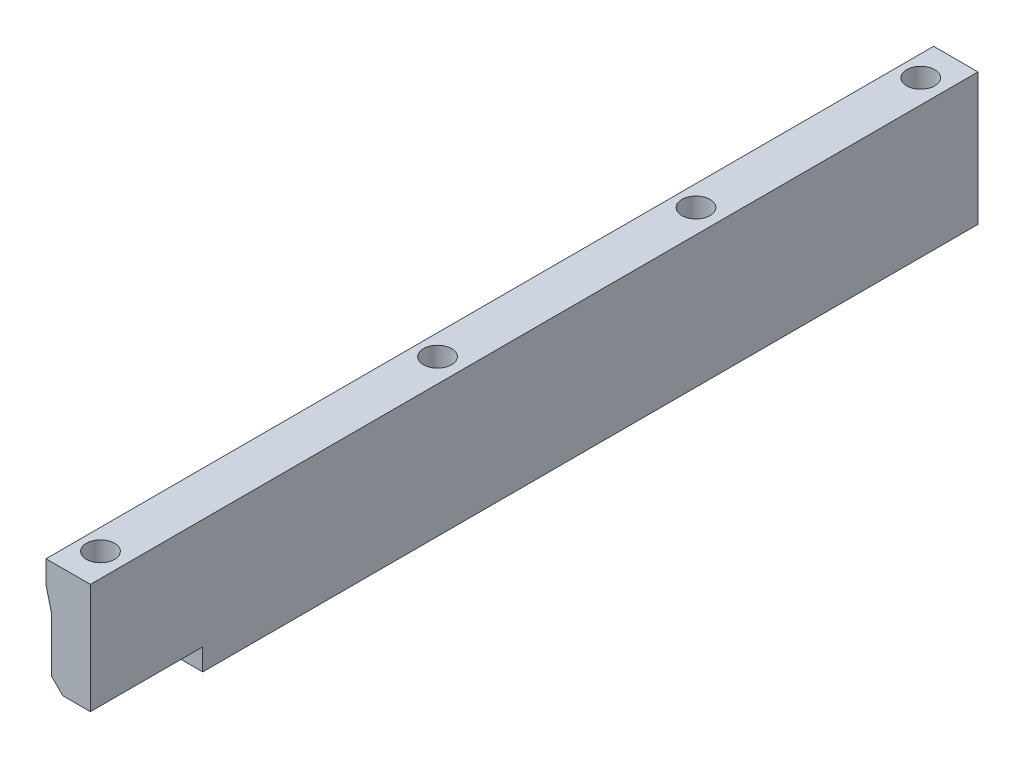
ISO-10303-21;
HEADER;
FILE_DESCRIPTION(('STEP AP214'),'2;1');
FILE_NAME('part.step','',(''),(''),'','','');
FILE_SCHEMA(('AUTOMOTIVE_DESIGN { 1 0 10303 214 1 1 1 1 }'));
ENDSEC;
DATA;
#1=APPLICATION_CONTEXT('core data for automotive mechanical design processes');
#2=APPLICATION_PROTOCOL_DEFINITION('international standard','automotive_design',2000,#1);
#3=PRODUCT_CONTEXT('',#1,'mechanical');
#4=PRODUCT('Part','Part','',(#3));
#5=PRODUCT_RELATED_PRODUCT_CATEGORY('part','',(#4));
#6=PRODUCT_DEFINITION_FORMATION('','',#4);
#7=PRODUCT_DEFINITION_CONTEXT('part definition',#1,'design');
#8=PRODUCT_DEFINITION('design','',#6,#7);
#9=PRODUCT_DEFINITION_SHAPE('','',#8);
#10=(LENGTH_UNIT() NAMED_UNIT(*) SI_UNIT(.MILLI.,.METRE.));
#11=(NAMED_UNIT(*) PLANE_ANGLE_UNIT() SI_UNIT($,.RADIAN.));
#12=(NAMED_UNIT(*) SI_UNIT($,.STERADIAN.) SOLID_ANGLE_UNIT());
#13=UNCERTAINTY_MEASURE_WITH_UNIT(LENGTH_MEASURE(1.E-05),#10,'distance_accuracy_value','');
#14=(GEOMETRIC_REPRESENTATION_CONTEXT(3) GLOBAL_UNCERTAINTY_ASSIGNED_CONTEXT((#13)) GLOBAL_UNIT_ASSIGNED_CONTEXT((#10,
#11,#12)) REPRESENTATION_CONTEXT('',''));
#15=CARTESIAN_POINT('',(0.,0.,0.));
#16=DIRECTION('',(0.,0.,1.));
#17=DIRECTION('',(1.,0.,0.));
#18=AXIS2_PLACEMENT_3D('',#15,#16,#17);
#19=CARTESIAN_POINT('',(0.,0.,0.));
#20=DIRECTION('',(0.,0.,-1.));
#21=DIRECTION('',(-1.,0.,0.));
#22=AXIS2_PLACEMENT_3D('',#19,#20,#21);
#23=PLANE('',#22);
#24=DIRECTION('',(0.,-1.,0.));
#25=VECTOR('',#24,1.);
#26=CARTESIAN_POINT('',(-45.4,0.,0.));
#27=LINE('',#26,#25);
#28=CARTESIAN_POINT('',(-45.4,2.25,0.));
#29=VERTEX_POINT('',#28);
#30=CARTESIAN_POINT('',(-45.4,-2.25,0.));
#31=VERTEX_POINT('',#30);
#32=EDGE_CURVE('E175',#29,#31,#27,.T.);
#33=ORIENTED_EDGE('',*,*,#32,.F.);
#34=DIRECTION('',(-1.,0.,0.));
#35=VECTOR('',#34,1.);
#36=CARTESIAN_POINT('',(-48.6,2.25,0.));
#37=LINE('',#36,#35);
#38=CARTESIAN_POINT('',(-48.6,2.25,0.));
#39=VERTEX_POINT('',#38);
#40=EDGE_CURVE('E210',#29,#39,#37,.T.);
#41=ORIENTED_EDGE('',*,*,#40,.T.);
#42=DIRECTION('',(0.,-1.,0.));
#43=VECTOR('',#42,1.);
#44=CARTESIAN_POINT('',(-48.6,-2.25,0.));
#45=LINE('',#44,#43);
#46=CARTESIAN_POINT('',(-48.6,-2.25,0.));
#47=VERTEX_POINT('',#46);
#48=EDGE_CURVE('E213',#39,#47,#45,.T.);
#49=ORIENTED_EDGE('',*,*,#48,.T.);
#50=DIRECTION('',(1.,0.,0.));
#51=VECTOR('',#50,1.);
#52=CARTESIAN_POINT('',(-45.4,-2.25,0.));
#53=LINE('',#52,#51);
#54=EDGE_CURVE('E216',#47,#31,#53,.T.);
#55=ORIENTED_EDGE('',*,*,#54,.T.);
#56=EDGE_LOOP('',(#33,#41,#49,#55));
#57=FACE_BOUND('',#56,.T.);
#58=ADVANCED_FACE('F34',(#57),#23,.F.);
#59=CARTESIAN_POINT('',(-38.5,14.25,-138.));
#60=DIRECTION('',(1.,0.,0.));
#61=DIRECTION('',(0.,0.,-1.));
#62=AXIS2_PLACEMENT_3D('',#59,#60,#61);
#63=PLANE('',#62);
#64=DIRECTION('',(0.,1.,0.));
#65=VECTOR('',#64,1.);
#66=CARTESIAN_POINT('',(-38.5,14.25,0.));
#67=LINE('',#66,#65);
#68=CARTESIAN_POINT('',(-38.5,-9.25,0.));
#69=VERTEX_POINT('',#68);
#70=CARTESIAN_POINT('',(-38.5,-5.37654590485204,0.));
#71=VERTEX_POINT('',#70);
#72=EDGE_CURVE('E147',#69,#71,#67,.T.);
#73=ORIENTED_EDGE('',*,*,#72,.F.);
#74=DIRECTION('',(0.,0.,1.));
#75=VECTOR('',#74,1.);
#76=CARTESIAN_POINT('',(-38.5,-9.25,-138.));
#77=LINE('',#76,#75);
#78=CARTESIAN_POINT('',(-38.5,-9.25,-138.));
#79=VERTEX_POINT('',#78);
#80=EDGE_CURVE('E178',#79,#69,#77,.T.);
#81=ORIENTED_EDGE('',*,*,#80,.F.);
#82=DIRECTION('',(0.,1.,0.));
#83=VECTOR('',#82,1.);
#84=CARTESIAN_POINT('',(-38.5,14.25,-138.));
#85=LINE('',#84,#83);
#86=CARTESIAN_POINT('',(-38.5,14.25,-138.));
#87=VERTEX_POINT('',#86);
#88=EDGE_CURVE('E181',#79,#87,#85,.T.);
#89=ORIENTED_EDGE('',*,*,#88,.T.);
#90=DIRECTION('',(0.,0.,1.));
#91=VECTOR('',#90,1.);
#92=CARTESIAN_POINT('',(-38.5,14.25,-138.));
#93=LINE('',#92,#91);
#94=CARTESIAN_POINT('',(-38.5,14.25,20.));
#95=VERTEX_POINT('',#94);
#96=EDGE_CURVE('E154',#87,#95,#93,.T.);
#97=ORIENTED_EDGE('',*,*,#96,.T.);
#98=DIRECTION('',(0.,1.,0.));
#99=VECTOR('',#98,1.);
#100=CARTESIAN_POINT('',(-38.5,0.,20.));
#101=LINE('',#100,#99);
#102=CARTESIAN_POINT('',(-38.5,-5.37654590485204,20.));
#103=VERTEX_POINT('',#102);
#104=EDGE_CURVE('E151',#103,#95,#101,.T.);
#105=ORIENTED_EDGE('',*,*,#104,.F.);
#106=DIRECTION('',(0.,0.,-1.));
#107=VECTOR('',#106,1.);
#108=CARTESIAN_POINT('',(-38.5,-5.37654590485204,20.));
#109=LINE('',#108,#107);
#110=EDGE_CURVE('E135',#103,#71,#109,.T.);
#111=ORIENTED_EDGE('',*,*,#110,.T.);
#112=EDGE_LOOP('',(#73,#81,#89,#97,#105,#111));
#113=FACE_BOUND('',#112,.T.);
#114=ADVANCED_FACE('F152',(#113),#63,.T.);
#115=CARTESIAN_POINT('',(-38.5,-9.25,-138.));
#116=DIRECTION('',(0.,-1.,0.));
#117=DIRECTION('',(0.,0.,-1.));
#118=AXIS2_PLACEMENT_3D('',#115,#116,#117);
#119=PLANE('',#118);
#120=DIRECTION('',(1.,0.,0.));
#121=VECTOR('',#120,1.);
#122=CARTESIAN_POINT('',(-38.5,-9.25,0.));
#123=LINE('',#122,#121);
#124=CARTESIAN_POINT('',(-43.4,-9.25,0.));
#125=VERTEX_POINT('',#124);
#126=EDGE_CURVE('E184',#125,#69,#123,.T.);
#127=ORIENTED_EDGE('',*,*,#126,.F.);
#128=DIRECTION('',(0.,0.,-1.));
#129=VECTOR('',#128,1.);
#130=CARTESIAN_POINT('',(-43.4,-9.25,-138.));
#131=LINE('',#130,#129);
#132=CARTESIAN_POINT('',(-43.4,-9.25,-138.));
#133=VERTEX_POINT('',#132);
#134=EDGE_CURVE('E49',#125,#133,#131,.T.);
#135=ORIENTED_EDGE('',*,*,#134,.T.);
#136=DIRECTION('',(1.,0.,0.));
#137=VECTOR('',#136,1.);
#138=CARTESIAN_POINT('',(-38.5,-9.25,-138.));
#139=LINE('',#138,#137);
#140=EDGE_CURVE('E207',#133,#79,#139,.T.);
#141=ORIENTED_EDGE('',*,*,#140,.T.);
#142=ORIENTED_EDGE('',*,*,#80,.T.);
#143=EDGE_LOOP('',(#127,#135,#141,#142));
#144=FACE_BOUND('',#143,.T.);
#145=ADVANCED_FACE('F273',(#144),#119,.T.);
#146=CARTESIAN_POINT('',(-45.4,-9.25,-138.));
#147=DIRECTION('',(-1.,0.,0.));
#148=DIRECTION('',(0.,-1.,0.));
#149=AXIS2_PLACEMENT_3D('',#146,#147,#148);
#150=PLANE('',#149);
#151=DIRECTION('',(0.,-1.,0.));
#152=VECTOR('',#151,1.);
#153=CARTESIAN_POINT('',(-45.4,-9.25,0.));
#154=LINE('',#153,#152);
#155=CARTESIAN_POINT('',(-45.4,-3.37654590485205,0.));
#156=VERTEX_POINT('',#155);
#157=CARTESIAN_POINT('',(-45.4,-7.25000000000001,0.));
#158=VERTEX_POINT('',#157);
#159=EDGE_CURVE('E219',#156,#158,#154,.T.);
#160=ORIENTED_EDGE('',*,*,#159,.F.);
#161=DIRECTION('',(0.,0.,1.));
#162=VECTOR('',#161,1.);
#163=CARTESIAN_POINT('',(-45.4,-3.37654590485205,-138.));
#164=LINE('',#163,#162);
#165=CARTESIAN_POINT('',(-45.4,-3.37654590485205,20.));
#166=VERTEX_POINT('',#165);
#167=EDGE_CURVE('E245',#156,#166,#164,.T.);
#168=ORIENTED_EDGE('',*,*,#167,.T.);
#169=DIRECTION('',(0.,-1.,0.));
#170=VECTOR('',#169,1.);
#171=CARTESIAN_POINT('',(-45.4,0.,20.));
#172=LINE('',#171,#170);
#173=CARTESIAN_POINT('',(-45.4,6.25,20.));
#174=VERTEX_POINT('',#173);
#175=EDGE_CURVE('E164',#174,#166,#172,.T.);
#176=ORIENTED_EDGE('',*,*,#175,.F.);
#177=DIRECTION('',(0.,0.,1.));
#178=VECTOR('',#177,1.);
#179=CARTESIAN_POINT('',(-45.4,6.25,-138.));
#180=LINE('',#179,#178);
#181=CARTESIAN_POINT('',(-45.4,6.25,-138.));
#182=VERTEX_POINT('',#181);
#183=EDGE_CURVE('E234',#182,#174,#180,.T.);
#184=ORIENTED_EDGE('',*,*,#183,.F.);
#185=DIRECTION('',(0.,-1.,0.));
#186=VECTOR('',#185,1.);
#187=CARTESIAN_POINT('',(-45.4,2.25,-138.));
#188=LINE('',#187,#186);
#189=CARTESIAN_POINT('',(-45.4,2.25,-138.));
#190=VERTEX_POINT('',#189);
#191=EDGE_CURVE('E192',#182,#190,#188,.T.);
#192=ORIENTED_EDGE('',*,*,#191,.T.);
#193=DIRECTION('',(0.,0.,1.));
#194=VECTOR('',#193,1.);
#195=CARTESIAN_POINT('',(-45.4,2.25,-138.));
#196=LINE('',#195,#194);
#197=EDGE_CURVE('E231',#190,#29,#196,.T.);
#198=ORIENTED_EDGE('',*,*,#197,.T.);
#199=ORIENTED_EDGE('',*,*,#32,.T.);
#200=DIRECTION('',(0.,0.,1.));
#201=VECTOR('',#200,1.);
#202=CARTESIAN_POINT('',(-45.4,-2.25,-138.));
#203=LINE('',#202,#201);
#204=CARTESIAN_POINT('',(-45.4,-2.25,-138.));
#205=VERTEX_POINT('',#204);
#206=EDGE_CURVE('E224',#205,#31,#203,.T.);
#207=ORIENTED_EDGE('',*,*,#206,.F.);
#208=DIRECTION('',(0.,-1.,0.));
#209=VECTOR('',#208,1.);
#210=CARTESIAN_POINT('',(-45.4,-9.25,-138.));
#211=LINE('',#210,#209);
#212=CARTESIAN_POINT('',(-45.4,-7.25000000000001,-138.));
#213=VERTEX_POINT('',#212);
#214=EDGE_CURVE('E204',#205,#213,#211,.T.);
#215=ORIENTED_EDGE('',*,*,#214,.T.);
#216=DIRECTION('',(0.,0.,1.));
#217=VECTOR('',#216,1.);
#218=CARTESIAN_POINT('',(-45.4,-7.25000000000001,-138.));
#219=LINE('',#218,#217);
#220=EDGE_CURVE('E242',#213,#158,#219,.T.);
#221=ORIENTED_EDGE('',*,*,#220,.T.);
#222=EDGE_LOOP('',(#160,#168,#176,#184,#192,#198,#199,#207,#215,#221));
#223=FACE_BOUND('',#222,.T.);
#224=ADVANCED_FACE('F258',(#223),#150,.T.);
#225=CARTESIAN_POINT('',(-45.4,-2.25,-138.));
#226=DIRECTION('',(0.,-1.,0.));
#227=DIRECTION('',(0.,0.,-1.));
#228=AXIS2_PLACEMENT_3D('',#225,#226,#227);
#229=PLANE('',#228);
#230=ORIENTED_EDGE('',*,*,#54,.F.);
#231=DIRECTION('',(0.,0.,1.));
#232=VECTOR('',#231,1.);
#233=CARTESIAN_POINT('',(-48.6,-2.25,-138.));
#234=LINE('',#233,#232);
#235=CARTESIAN_POINT('',(-48.6,-2.25,-138.));
#236=VERTEX_POINT('',#235);
#237=EDGE_CURVE('E227',#236,#47,#234,.T.);
#238=ORIENTED_EDGE('',*,*,#237,.F.);
#239=DIRECTION('',(1.,0.,0.));
#240=VECTOR('',#239,1.);
#241=CARTESIAN_POINT('',(-45.4,-2.25,-138.));
#242=LINE('',#241,#240);
#243=EDGE_CURVE('E201',#236,#205,#242,.T.);
#244=ORIENTED_EDGE('',*,*,#243,.T.);
#245=ORIENTED_EDGE('',*,*,#206,.T.);
#246=EDGE_LOOP('',(#230,#238,#244,#245));
#247=FACE_BOUND('',#246,.T.);
#248=ADVANCED_FACE('F307',(#247),#229,.T.);
#249=CARTESIAN_POINT('',(-48.6,-2.25,-138.));
#250=DIRECTION('',(-1.,0.,0.));
#251=DIRECTION('',(0.,0.,1.));
#252=AXIS2_PLACEMENT_3D('',#249,#250,#251);
#253=PLANE('',#252);
#254=ORIENTED_EDGE('',*,*,#48,.F.);
#255=DIRECTION('',(0.,0.,1.));
#256=VECTOR('',#255,1.);
#257=CARTESIAN_POINT('',(-48.6,2.25,-138.));
#258=LINE('',#257,#256);
#259=CARTESIAN_POINT('',(-48.6,2.25,-138.));
#260=VERTEX_POINT('',#259);
#261=EDGE_CURVE('E229',#260,#39,#258,.T.);
#262=ORIENTED_EDGE('',*,*,#261,.F.);
#263=DIRECTION('',(0.,-1.,0.));
#264=VECTOR('',#263,1.);
#265=CARTESIAN_POINT('',(-48.6,-2.25,-138.));
#266=LINE('',#265,#264);
#267=EDGE_CURVE('E198',#260,#236,#266,.T.);
#268=ORIENTED_EDGE('',*,*,#267,.T.);
#269=ORIENTED_EDGE('',*,*,#237,.T.);
#270=EDGE_LOOP('',(#254,#262,#268,#269));
#271=FACE_BOUND('',#270,.T.);
#272=ADVANCED_FACE('F309',(#271),#253,.T.);
#273=CARTESIAN_POINT('',(-48.6,2.25,-138.));
#274=DIRECTION('',(0.,1.,0.));
#275=DIRECTION('',(0.,0.,1.));
#276=AXIS2_PLACEMENT_3D('',#273,#274,#275);
#277=PLANE('',#276);
#278=ORIENTED_EDGE('',*,*,#40,.F.);
#279=ORIENTED_EDGE('',*,*,#197,.F.);
#280=DIRECTION('',(-1.,0.,0.));
#281=VECTOR('',#280,1.);
#282=CARTESIAN_POINT('',(-48.6,2.25,-138.));
#283=LINE('',#282,#281);
#284=EDGE_CURVE('E195',#190,#260,#283,.T.);
#285=ORIENTED_EDGE('',*,*,#284,.T.);
#286=ORIENTED_EDGE('',*,*,#261,.T.);
#287=EDGE_LOOP('',(#278,#279,#285,#286));
#288=FACE_BOUND('',#287,.T.);
#289=ADVANCED_FACE('F303',(#288),#277,.T.);
#290=CARTESIAN_POINT('',(-46.4,10.25,-138.));
#291=DIRECTION('',(-0.970142500145332,-0.242535625036333,0.));
#292=DIRECTION('',(0.242535625036333,-0.970142500145332,0.));
#293=AXIS2_PLACEMENT_3D('',#290,#291,#292);
#294=PLANE('',#293);
#295=ORIENTED_EDGE('',*,*,#183,.T.);
#296=DIRECTION('',(0.242535625036333,-0.970142500145332,0.));
#297=VECTOR('',#296,1.);
#298=CARTESIAN_POINT('',(-41.2588235294118,-10.3147058823529,20.));
#299=LINE('',#298,#297);
#300=CARTESIAN_POINT('',(-46.4,10.25,20.));
#301=VERTEX_POINT('',#300);
#302=EDGE_CURVE('E148',#301,#174,#299,.T.);
#303=ORIENTED_EDGE('',*,*,#302,.F.);
#304=DIRECTION('',(0.,0.,1.));
#305=VECTOR('',#304,1.);
#306=CARTESIAN_POINT('',(-46.4,10.25,-138.));
#307=LINE('',#306,#305);
#308=CARTESIAN_POINT('',(-46.4,10.25,-138.));
#309=VERTEX_POINT('',#308);
#310=EDGE_CURVE('E236',#309,#301,#307,.T.);
#311=ORIENTED_EDGE('',*,*,#310,.F.);
#312=DIRECTION('',(0.242535625036333,-0.970142500145332,0.));
#313=VECTOR('',#312,1.);
#314=CARTESIAN_POINT('',(-46.4,10.25,-138.));
#315=LINE('',#314,#313);
#316=EDGE_CURVE('E189',#309,#182,#315,.T.);
#317=ORIENTED_EDGE('',*,*,#316,.T.);
#318=EDGE_LOOP('',(#295,#303,#311,#317));
#319=FACE_BOUND('',#318,.T.);
#320=ADVANCED_FACE('F297',(#319),#294,.T.);
#321=CARTESIAN_POINT('',(-46.4,14.25,-138.));
#322=DIRECTION('',(-1.,0.,0.));
#323=DIRECTION('',(0.,0.,1.));
#324=AXIS2_PLACEMENT_3D('',#321,#322,#323);
#325=PLANE('',#324);
#326=ORIENTED_EDGE('',*,*,#310,.T.);
#327=DIRECTION('',(0.,-1.,0.));
#328=VECTOR('',#327,1.);
#329=CARTESIAN_POINT('',(-46.4,0.,20.));
#330=LINE('',#329,#328);
#331=CARTESIAN_POINT('',(-46.4,14.25,20.));
#332=VERTEX_POINT('',#331);
#333=EDGE_CURVE('E170',#332,#301,#330,.T.);
#334=ORIENTED_EDGE('',*,*,#333,.F.);
#335=DIRECTION('',(0.,0.,1.));
#336=VECTOR('',#335,1.);
#337=CARTESIAN_POINT('',(-46.4,14.25,-138.));
#338=LINE('',#337,#336);
#339=CARTESIAN_POINT('',(-46.4,14.25,-138.));
#340=VERTEX_POINT('',#339);
#341=EDGE_CURVE('E238',#340,#332,#338,.T.);
#342=ORIENTED_EDGE('',*,*,#341,.F.);
#343=DIRECTION('',(0.,-1.,0.));
#344=VECTOR('',#343,1.);
#345=CARTESIAN_POINT('',(-46.4,14.25,-138.));
#346=LINE('',#345,#344);
#347=EDGE_CURVE('E186',#340,#309,#346,.T.);
#348=ORIENTED_EDGE('',*,*,#347,.T.);
#349=EDGE_LOOP('',(#326,#334,#342,#348));
#350=FACE_BOUND('',#349,.T.);
#351=ADVANCED_FACE('F295',(#350),#325,.T.);
#352=CARTESIAN_POINT('',(-45.4,14.25,-138.));
#353=DIRECTION('',(0.,1.,0.));
#354=DIRECTION('',(0.,0.,1.));
#355=AXIS2_PLACEMENT_3D('',#352,#353,#354);
#356=PLANE('',#355);
#357=CARTESIAN_POINT('',(-42.7,14.25,-132.));
#358=DIRECTION('',(0.,1.,0.));
#359=DIRECTION('',(0.,0.,1.));
#360=AXIS2_PLACEMENT_3D('',#357,#358,#359);
#361=CIRCLE('',#360,2.5);
#362=CARTESIAN_POINT('',(-42.7,14.25,-129.5));
#363=VERTEX_POINT('',#362);
#364=EDGE_CURVE('E331',#363,#363,#361,.T.);
#365=ORIENTED_EDGE('',*,*,#364,.F.);
#366=EDGE_LOOP('',(#365));
#367=FACE_BOUND('',#366,.T.);
#368=CARTESIAN_POINT('',(-42.7,14.25,-92.));
#369=DIRECTION('',(0.,1.,0.));
#370=DIRECTION('',(0.,0.,1.));
#371=AXIS2_PLACEMENT_3D('',#368,#369,#370);
#372=CIRCLE('',#371,2.5);
#373=CARTESIAN_POINT('',(-42.7,14.25,-89.5));
#374=VERTEX_POINT('',#373);
#375=EDGE_CURVE('E335',#374,#374,#372,.T.);
#376=ORIENTED_EDGE('',*,*,#375,.F.);
#377=EDGE_LOOP('',(#376));
#378=FACE_BOUND('',#377,.T.);
#379=CARTESIAN_POINT('',(-42.7,14.25,-46.));
#380=DIRECTION('',(0.,1.,0.));
#381=DIRECTION('',(0.,0.,1.));
#382=AXIS2_PLACEMENT_3D('',#379,#380,#381);
#383=CIRCLE('',#382,2.5);
#384=CARTESIAN_POINT('',(-42.7,14.25,-43.5));
#385=VERTEX_POINT('',#384);
#386=EDGE_CURVE('E339',#385,#385,#383,.T.);
#387=ORIENTED_EDGE('',*,*,#386,.F.);
#388=EDGE_LOOP('',(#387));
#389=FACE_BOUND('',#388,.T.);
#390=CARTESIAN_POINT('',(-42.7,14.25,14.));
#391=DIRECTION('',(0.,1.,0.));
#392=DIRECTION('',(0.,0.,1.));
#393=AXIS2_PLACEMENT_3D('',#390,#391,#392);
#394=CIRCLE('',#393,2.5);
#395=CARTESIAN_POINT('',(-42.7,14.25,16.5));
#396=VERTEX_POINT('',#395);
#397=EDGE_CURVE('E342',#396,#396,#394,.T.);
#398=ORIENTED_EDGE('',*,*,#397,.F.);
#399=EDGE_LOOP('',(#398));
#400=FACE_BOUND('',#399,.T.);
#401=ORIENTED_EDGE('',*,*,#341,.T.);
#402=DIRECTION('',(-1.,0.,0.));
#403=VECTOR('',#402,1.);
#404=CARTESIAN_POINT('',(0.,14.25,20.));
#405=LINE('',#404,#403);
#406=EDGE_CURVE('E158',#95,#332,#405,.T.);
#407=ORIENTED_EDGE('',*,*,#406,.F.);
#408=ORIENTED_EDGE('',*,*,#96,.F.);
#409=DIRECTION('',(-1.,0.,0.));
#410=VECTOR('',#409,1.);
#411=CARTESIAN_POINT('',(-45.4,14.25,-138.));
#412=LINE('',#411,#410);
#413=EDGE_CURVE('E183',#87,#340,#412,.T.);
#414=ORIENTED_EDGE('',*,*,#413,.T.);
#415=EDGE_LOOP('',(#401,#407,#408,#414));
#416=FACE_BOUND('',#415,.T.);
#417=ADVANCED_FACE('F283',(#367,#378,#389,#400,#416),#356,.T.);
#418=CARTESIAN_POINT('',(0.,0.,-138.));
#419=DIRECTION('',(0.,0.,-1.));
#420=DIRECTION('',(-1.,0.,0.));
#421=AXIS2_PLACEMENT_3D('',#418,#419,#420);
#422=PLANE('',#421);
#423=ORIENTED_EDGE('',*,*,#140,.F.);
#424=DIRECTION('',(0.707106781186548,-0.707106781186548,0.));
#425=VECTOR('',#424,1.);
#426=CARTESIAN_POINT('',(-26.325,-26.325,-138.));
#427=LINE('',#426,#425);
#428=EDGE_CURVE('E42',#133,#213,#427,.F.);
#429=ORIENTED_EDGE('',*,*,#428,.T.);
#430=ORIENTED_EDGE('',*,*,#214,.F.);
#431=ORIENTED_EDGE('',*,*,#243,.F.);
#432=ORIENTED_EDGE('',*,*,#267,.F.);
#433=ORIENTED_EDGE('',*,*,#284,.F.);
#434=ORIENTED_EDGE('',*,*,#191,.F.);
#435=ORIENTED_EDGE('',*,*,#316,.F.);
#436=ORIENTED_EDGE('',*,*,#347,.F.);
#437=ORIENTED_EDGE('',*,*,#413,.F.);
#438=ORIENTED_EDGE('',*,*,#88,.F.);
#439=EDGE_LOOP('',(#423,#429,#430,#431,#432,#433,#434,#435,#436,#437,#438));
#440=FACE_BOUND('',#439,.T.);
#441=ADVANCED_FACE('F252',(#440),#422,.T.);
#442=ORIENTED_EDGE('',*,*,#159,.T.);
#443=DIRECTION('',(-0.707106781186548,0.707106781186548,0.));
#444=VECTOR('',#443,1.);
#445=CARTESIAN_POINT('',(-45.4,-7.25000000000001,0.));
#446=LINE('',#445,#444);
#447=EDGE_CURVE('E57',#158,#125,#446,.F.);
#448=ORIENTED_EDGE('',*,*,#447,.T.);
#449=ORIENTED_EDGE('',*,*,#126,.T.);
#450=ORIENTED_EDGE('',*,*,#72,.T.);
#451=DIRECTION('',(-1.,0.,0.));
#452=VECTOR('',#451,1.);
#453=CARTESIAN_POINT('',(0.,-5.37654590485204,0.));
#454=LINE('',#453,#452);
#455=CARTESIAN_POINT('',(-43.4,-5.37654590485204,0.));
#456=VERTEX_POINT('',#455);
#457=EDGE_CURVE('E143',#71,#456,#454,.T.);
#458=ORIENTED_EDGE('',*,*,#457,.T.);
#459=DIRECTION('',(0.707106781186548,-0.707106781186548,0.));
#460=VECTOR('',#459,1.);
#461=CARTESIAN_POINT('',(-24.388272952426,-24.388272952426,0.));
#462=LINE('',#461,#460);
#463=EDGE_CURVE('E11',#456,#156,#462,.F.);
#464=ORIENTED_EDGE('',*,*,#463,.T.);
#465=EDGE_LOOP('',(#442,#448,#449,#450,#458,#464));
#466=FACE_BOUND('',#465,.T.);
#467=ADVANCED_FACE('F269',(#466),#23,.F.);
#468=CARTESIAN_POINT('',(0.,-5.37654590485204,20.));
#469=DIRECTION('',(0.,-1.,0.));
#470=DIRECTION('',(0.,0.,-1.));
#471=AXIS2_PLACEMENT_3D('',#468,#469,#470);
#472=PLANE('',#471);
#473=DIRECTION('',(-1.,0.,0.));
#474=VECTOR('',#473,1.);
#475=CARTESIAN_POINT('',(0.,-5.37654590485204,20.));
#476=LINE('',#475,#474);
#477=CARTESIAN_POINT('',(-43.4,-5.37654590485204,20.));
#478=VERTEX_POINT('',#477);
#479=EDGE_CURVE('E140',#103,#478,#476,.T.);
#480=ORIENTED_EDGE('',*,*,#479,.T.);
#481=DIRECTION('',(0.,0.,-1.));
#482=VECTOR('',#481,1.);
#483=CARTESIAN_POINT('',(-43.4,-5.37654590485204,20.));
#484=LINE('',#483,#482);
#485=EDGE_CURVE('E177',#478,#456,#484,.T.);
#486=ORIENTED_EDGE('',*,*,#485,.T.);
#487=ORIENTED_EDGE('',*,*,#457,.F.);
#488=ORIENTED_EDGE('',*,*,#110,.F.);
#489=EDGE_LOOP('',(#480,#486,#487,#488));
#490=FACE_BOUND('',#489,.T.);
#491=ADVANCED_FACE('F137',(#490),#472,.T.);
#492=CARTESIAN_POINT('',(0.,0.,20.));
#493=DIRECTION('',(0.,0.,1.));
#494=DIRECTION('',(1.,0.,0.));
#495=AXIS2_PLACEMENT_3D('',#492,#493,#494);
#496=PLANE('',#495);
#497=ORIENTED_EDGE('',*,*,#175,.T.);
#498=DIRECTION('',(-0.707106781186548,0.707106781186548,0.));
#499=VECTOR('',#498,1.);
#500=CARTESIAN_POINT('',(-24.388272952426,-24.388272952426,20.));
#501=LINE('',#500,#499);
#502=EDGE_CURVE('E163',#166,#478,#501,.F.);
#503=ORIENTED_EDGE('',*,*,#502,.T.);
#504=ORIENTED_EDGE('',*,*,#479,.F.);
#505=ORIENTED_EDGE('',*,*,#104,.T.);
#506=ORIENTED_EDGE('',*,*,#406,.T.);
#507=ORIENTED_EDGE('',*,*,#333,.T.);
#508=ORIENTED_EDGE('',*,*,#302,.T.);
#509=EDGE_LOOP('',(#497,#503,#504,#505,#506,#507,#508));
#510=FACE_BOUND('',#509,.T.);
#511=ADVANCED_FACE('F161',(#510),#496,.T.);
#512=CARTESIAN_POINT('',(-42.7,-0.749999999999999,14.));
#513=DIRECTION('',(0.,-1.,0.));
#514=DIRECTION('',(0.,0.,-1.));
#515=AXIS2_PLACEMENT_3D('',#512,#513,#514);
#516=PLANE('',#515);
#517=CARTESIAN_POINT('',(-42.7,-0.749999999999999,14.));
#518=DIRECTION('',(0.,1.,0.));
#519=DIRECTION('',(0.,0.,1.));
#520=AXIS2_PLACEMENT_3D('',#517,#518,#519);
#521=CIRCLE('',#520,1.6);
#522=CARTESIAN_POINT('',(-42.7,-0.749999999999999,15.6));
#523=VERTEX_POINT('',#522);
#524=EDGE_CURVE('E179',#523,#523,#521,.T.);
#525=ORIENTED_EDGE('',*,*,#524,.T.);
#526=EDGE_LOOP('',(#525));
#527=FACE_BOUND('',#526,.T.);
#528=ADVANCED_FACE('F359',(#527),#516,.F.);
#529=CARTESIAN_POINT('',(-42.7,14.25,14.));
#530=DIRECTION('',(0.,1.,0.));
#531=DIRECTION('',(0.,0.,1.));
#532=AXIS2_PLACEMENT_3D('',#529,#530,#531);
#533=CYLINDRICAL_SURFACE('',#532,1.6);
#534=ORIENTED_EDGE('',*,*,#524,.F.);
#535=EDGE_LOOP('',(#534));
#536=FACE_BOUND('',#535,.T.);
#537=CARTESIAN_POINT('',(-42.7,9.25,14.));
#538=DIRECTION('',(0.,1.,0.));
#539=DIRECTION('',(0.,0.,1.));
#540=AXIS2_PLACEMENT_3D('',#537,#538,#539);
#541=CIRCLE('',#540,1.6);
#542=CARTESIAN_POINT('',(-42.7,9.25,15.6));
#543=VERTEX_POINT('',#542);
#544=EDGE_CURVE('E348',#543,#543,#541,.T.);
#545=ORIENTED_EDGE('',*,*,#544,.T.);
#546=EDGE_LOOP('',(#545));
#547=FACE_BOUND('',#546,.T.);
#548=ADVANCED_FACE('F361',(#536,#547),#533,.F.);
#549=CARTESIAN_POINT('',(-41.1,9.25,14.));
#550=DIRECTION('',(0.,-1.,0.));
#551=DIRECTION('',(0.,0.,-1.));
#552=AXIS2_PLACEMENT_3D('',#549,#550,#551);
#553=PLANE('',#552);
#554=ORIENTED_EDGE('',*,*,#544,.F.);
#555=EDGE_LOOP('',(#554));
#556=FACE_BOUND('',#555,.T.);
#557=CARTESIAN_POINT('',(-42.7,9.25,14.));
#558=DIRECTION('',(0.,1.,0.));
#559=DIRECTION('',(0.,0.,1.));
#560=AXIS2_PLACEMENT_3D('',#557,#558,#559);
#561=CIRCLE('',#560,2.5);
#562=CARTESIAN_POINT('',(-42.7,9.25,16.5));
#563=VERTEX_POINT('',#562);
#564=EDGE_CURVE('E344',#563,#563,#561,.T.);
#565=ORIENTED_EDGE('',*,*,#564,.T.);
#566=EDGE_LOOP('',(#565));
#567=FACE_BOUND('',#566,.T.);
#568=ADVANCED_FACE('F364',(#556,#567),#553,.F.);
#569=CARTESIAN_POINT('',(-42.7,14.25,14.));
#570=DIRECTION('',(0.,1.,0.));
#571=DIRECTION('',(0.,0.,1.));
#572=AXIS2_PLACEMENT_3D('',#569,#570,#571);
#573=CYLINDRICAL_SURFACE('',#572,2.5);
#574=ORIENTED_EDGE('',*,*,#564,.F.);
#575=EDGE_LOOP('',(#574));
#576=FACE_BOUND('',#575,.T.);
#577=ORIENTED_EDGE('',*,*,#397,.T.);
#578=EDGE_LOOP('',(#577));
#579=FACE_BOUND('',#578,.T.);
#580=ADVANCED_FACE('F370',(#576,#579),#573,.F.);
#581=CARTESIAN_POINT('',(-42.7,-0.749999999999999,-46.));
#582=DIRECTION('',(0.,-1.,0.));
#583=DIRECTION('',(0.,0.,-1.));
#584=AXIS2_PLACEMENT_3D('',#581,#582,#583);
#585=PLANE('',#584);
#586=CARTESIAN_POINT('',(-42.7,-0.749999999999999,-46.));
#587=DIRECTION('',(0.,1.,0.));
#588=DIRECTION('',(0.,0.,1.));
#589=AXIS2_PLACEMENT_3D('',#586,#587,#588);
#590=CIRCLE('',#589,1.6);
#591=CARTESIAN_POINT('',(-42.7,-0.749999999999999,-44.4));
#592=VERTEX_POINT('',#591);
#593=EDGE_CURVE('E345',#592,#592,#590,.T.);
#594=ORIENTED_EDGE('',*,*,#593,.T.);
#595=EDGE_LOOP('',(#594));
#596=FACE_BOUND('',#595,.T.);
#597=ADVANCED_FACE('F375',(#596),#585,.F.);
#598=CARTESIAN_POINT('',(-42.7,14.25,-46.));
#599=DIRECTION('',(0.,1.,0.));
#600=DIRECTION('',(0.,0.,1.));
#601=AXIS2_PLACEMENT_3D('',#598,#599,#600);
#602=CYLINDRICAL_SURFACE('',#601,1.6);
#603=ORIENTED_EDGE('',*,*,#593,.F.);
#604=EDGE_LOOP('',(#603));
#605=FACE_BOUND('',#604,.T.);
#606=CARTESIAN_POINT('',(-42.7,9.25,-46.));
#607=DIRECTION('',(0.,1.,0.));
#608=DIRECTION('',(0.,0.,1.));
#609=AXIS2_PLACEMENT_3D('',#606,#607,#608);
#610=CIRCLE('',#609,1.6);
#611=CARTESIAN_POINT('',(-42.7,9.25,-44.4));
#612=VERTEX_POINT('',#611);
#613=EDGE_CURVE('E351',#612,#612,#610,.T.);
#614=ORIENTED_EDGE('',*,*,#613,.T.);
#615=EDGE_LOOP('',(#614));
#616=FACE_BOUND('',#615,.T.);
#617=ADVANCED_FACE('F380',(#605,#616),#602,.F.);
#618=CARTESIAN_POINT('',(-41.1,9.25,-46.));
#619=DIRECTION('',(0.,-1.,0.));
#620=DIRECTION('',(0.,0.,-1.));
#621=AXIS2_PLACEMENT_3D('',#618,#619,#620);
#622=PLANE('',#621);
#623=ORIENTED_EDGE('',*,*,#613,.F.);
#624=EDGE_LOOP('',(#623));
#625=FACE_BOUND('',#624,.T.);
#626=CARTESIAN_POINT('',(-42.7,9.25,-46.));
#627=DIRECTION('',(0.,1.,0.));
#628=DIRECTION('',(0.,0.,1.));
#629=AXIS2_PLACEMENT_3D('',#626,#627,#628);
#630=CIRCLE('',#629,2.5);
#631=CARTESIAN_POINT('',(-42.7,9.25,-43.5));
#632=VERTEX_POINT('',#631);
#633=EDGE_CURVE('E680',#632,#632,#630,.T.);
#634=ORIENTED_EDGE('',*,*,#633,.T.);
#635=EDGE_LOOP('',(#634));
#636=FACE_BOUND('',#635,.T.);
#637=ADVANCED_FACE('F424',(#625,#636),#622,.F.);
#638=CARTESIAN_POINT('',(-42.7,14.25,-46.));
#639=DIRECTION('',(0.,1.,0.));
#640=DIRECTION('',(0.,0.,1.));
#641=AXIS2_PLACEMENT_3D('',#638,#639,#640);
#642=CYLINDRICAL_SURFACE('',#641,2.5);
#643=ORIENTED_EDGE('',*,*,#633,.F.);
#644=EDGE_LOOP('',(#643));
#645=FACE_BOUND('',#644,.T.);
#646=ORIENTED_EDGE('',*,*,#386,.T.);
#647=EDGE_LOOP('',(#646));
#648=FACE_BOUND('',#647,.T.);
#649=ADVANCED_FACE('F433',(#645,#648),#642,.F.);
#650=CARTESIAN_POINT('',(-42.7,-0.749999999999999,-92.));
#651=DIRECTION('',(0.,-1.,0.));
#652=DIRECTION('',(0.,0.,-1.));
#653=AXIS2_PLACEMENT_3D('',#650,#651,#652);
#654=PLANE('',#653);
#655=CARTESIAN_POINT('',(-42.7,-0.749999999999999,-92.));
#656=DIRECTION('',(0.,1.,0.));
#657=DIRECTION('',(0.,0.,1.));
#658=AXIS2_PLACEMENT_3D('',#655,#656,#657);
#659=CIRCLE('',#658,1.6);
#660=CARTESIAN_POINT('',(-42.7,-0.749999999999999,-90.4));
#661=VERTEX_POINT('',#660);
#662=EDGE_CURVE('E676',#661,#661,#659,.T.);
#663=ORIENTED_EDGE('',*,*,#662,.T.);
#664=EDGE_LOOP('',(#663));
#665=FACE_BOUND('',#664,.T.);
#666=ADVANCED_FACE('F443',(#665),#654,.F.);
#667=CARTESIAN_POINT('',(-42.7,14.25,-92.));
#668=DIRECTION('',(0.,1.,0.));
#669=DIRECTION('',(0.,0.,1.));
#670=AXIS2_PLACEMENT_3D('',#667,#668,#669);
#671=CYLINDRICAL_SURFACE('',#670,1.6);
#672=ORIENTED_EDGE('',*,*,#662,.F.);
#673=EDGE_LOOP('',(#672));
#674=FACE_BOUND('',#673,.T.);
#675=CARTESIAN_POINT('',(-42.7,9.25,-92.));
#676=DIRECTION('',(0.,1.,0.));
#677=DIRECTION('',(0.,0.,1.));
#678=AXIS2_PLACEMENT_3D('',#675,#676,#677);
#679=CIRCLE('',#678,1.6);
#680=CARTESIAN_POINT('',(-42.7,9.25,-90.4));
#681=VERTEX_POINT('',#680);
#682=EDGE_CURVE('E673',#681,#681,#679,.T.);
#683=ORIENTED_EDGE('',*,*,#682,.T.);
#684=EDGE_LOOP('',(#683));
#685=FACE_BOUND('',#684,.T.);
#686=ADVANCED_FACE('F453',(#674,#685),#671,.F.);
#687=CARTESIAN_POINT('',(-41.1,9.25,-92.));
#688=DIRECTION('',(0.,-1.,0.));
#689=DIRECTION('',(0.,0.,-1.));
#690=AXIS2_PLACEMENT_3D('',#687,#688,#689);
#691=PLANE('',#690);
#692=ORIENTED_EDGE('',*,*,#682,.F.);
#693=EDGE_LOOP('',(#692));
#694=FACE_BOUND('',#693,.T.);
#695=CARTESIAN_POINT('',(-42.7,9.25,-92.));
#696=DIRECTION('',(0.,1.,0.));
#697=DIRECTION('',(0.,0.,1.));
#698=AXIS2_PLACEMENT_3D('',#695,#696,#697);
#699=CIRCLE('',#698,2.5);
#700=CARTESIAN_POINT('',(-42.7,9.25,-89.5));
#701=VERTEX_POINT('',#700);
#702=EDGE_CURVE('E670',#701,#701,#699,.T.);
#703=ORIENTED_EDGE('',*,*,#702,.T.);
#704=EDGE_LOOP('',(#703));
#705=FACE_BOUND('',#704,.T.);
#706=ADVANCED_FACE('F463',(#694,#705),#691,.F.);
#707=CARTESIAN_POINT('',(-42.7,14.25,-92.));
#708=DIRECTION('',(0.,1.,0.));
#709=DIRECTION('',(0.,0.,1.));
#710=AXIS2_PLACEMENT_3D('',#707,#708,#709);
#711=CYLINDRICAL_SURFACE('',#710,2.5);
#712=ORIENTED_EDGE('',*,*,#702,.F.);
#713=EDGE_LOOP('',(#712));
#714=FACE_BOUND('',#713,.T.);
#715=ORIENTED_EDGE('',*,*,#375,.T.);
#716=EDGE_LOOP('',(#715));
#717=FACE_BOUND('',#716,.T.);
#718=ADVANCED_FACE('F473',(#714,#717),#711,.F.);
#719=CARTESIAN_POINT('',(-42.7,-0.749999999999999,-132.));
#720=DIRECTION('',(0.,-1.,0.));
#721=DIRECTION('',(0.,0.,-1.));
#722=AXIS2_PLACEMENT_3D('',#719,#720,#721);
#723=PLANE('',#722);
#724=CARTESIAN_POINT('',(-42.7,-0.749999999999999,-132.));
#725=DIRECTION('',(0.,1.,0.));
#726=DIRECTION('',(0.,0.,1.));
#727=AXIS2_PLACEMENT_3D('',#724,#725,#726);
#728=CIRCLE('',#727,1.6);
#729=CARTESIAN_POINT('',(-42.7,-0.749999999999999,-130.4));
#730=VERTEX_POINT('',#729);
#731=EDGE_CURVE('E666',#730,#730,#728,.T.);
#732=ORIENTED_EDGE('',*,*,#731,.T.);
#733=EDGE_LOOP('',(#732));
#734=FACE_BOUND('',#733,.T.);
#735=ADVANCED_FACE('F483',(#734),#723,.F.);
#736=CARTESIAN_POINT('',(-42.7,14.25,-132.));
#737=DIRECTION('',(0.,1.,0.));
#738=DIRECTION('',(0.,0.,1.));
#739=AXIS2_PLACEMENT_3D('',#736,#737,#738);
#740=CYLINDRICAL_SURFACE('',#739,1.6);
#741=ORIENTED_EDGE('',*,*,#731,.F.);
#742=EDGE_LOOP('',(#741));
#743=FACE_BOUND('',#742,.T.);
#744=CARTESIAN_POINT('',(-42.7,9.25,-132.));
#745=DIRECTION('',(0.,1.,0.));
#746=DIRECTION('',(0.,0.,1.));
#747=AXIS2_PLACEMENT_3D('',#744,#745,#746);
#748=CIRCLE('',#747,1.6);
#749=CARTESIAN_POINT('',(-42.7,9.25,-130.4));
#750=VERTEX_POINT('',#749);
#751=EDGE_CURVE('E661',#750,#750,#748,.T.);
#752=ORIENTED_EDGE('',*,*,#751,.T.);
#753=EDGE_LOOP('',(#752));
#754=FACE_BOUND('',#753,.T.);
#755=ADVANCED_FACE('F493',(#743,#754),#740,.F.);
#756=CARTESIAN_POINT('',(-41.1,9.25,-132.));
#757=DIRECTION('',(0.,-1.,0.));
#758=DIRECTION('',(0.,0.,-1.));
#759=AXIS2_PLACEMENT_3D('',#756,#757,#758);
#760=PLANE('',#759);
#761=ORIENTED_EDGE('',*,*,#751,.F.);
#762=EDGE_LOOP('',(#761));
#763=FACE_BOUND('',#762,.T.);
#764=CARTESIAN_POINT('',(-42.7,9.25,-132.));
#765=DIRECTION('',(0.,1.,0.));
#766=DIRECTION('',(0.,0.,1.));
#767=AXIS2_PLACEMENT_3D('',#764,#765,#766);
#768=CIRCLE('',#767,2.5);
#769=CARTESIAN_POINT('',(-42.7,9.25,-129.5));
#770=VERTEX_POINT('',#769);
#771=EDGE_CURVE('E659',#770,#770,#768,.T.);
#772=ORIENTED_EDGE('',*,*,#771,.T.);
#773=EDGE_LOOP('',(#772));
#774=FACE_BOUND('',#773,.T.);
#775=ADVANCED_FACE('F503',(#763,#774),#760,.F.);
#776=CARTESIAN_POINT('',(-42.7,14.25,-132.));
#777=DIRECTION('',(0.,1.,0.));
#778=DIRECTION('',(0.,0.,1.));
#779=AXIS2_PLACEMENT_3D('',#776,#777,#778);
#780=CYLINDRICAL_SURFACE('',#779,2.5);
#781=ORIENTED_EDGE('',*,*,#771,.F.);
#782=EDGE_LOOP('',(#781));
#783=FACE_BOUND('',#782,.T.);
#784=ORIENTED_EDGE('',*,*,#364,.T.);
#785=EDGE_LOOP('',(#784));
#786=FACE_BOUND('',#785,.T.);
#787=ADVANCED_FACE('F264',(#783,#786),#780,.F.);
#788=CARTESIAN_POINT('',(-43.4,-5.37654590485204,20.));
#789=DIRECTION('',(0.707106781186547,0.707106781186547,0.));
#790=DIRECTION('',(0.,0.,-1.));
#791=AXIS2_PLACEMENT_3D('',#788,#789,#790);
#792=PLANE('',#791);
#793=ORIENTED_EDGE('',*,*,#502,.F.);
#794=ORIENTED_EDGE('',*,*,#167,.F.);
#795=ORIENTED_EDGE('',*,*,#463,.F.);
#796=ORIENTED_EDGE('',*,*,#485,.F.);
#797=EDGE_LOOP('',(#793,#794,#795,#796));
#798=FACE_BOUND('',#797,.T.);
#799=ADVANCED_FACE('F260',(#798),#792,.F.);
#800=CARTESIAN_POINT('',(-45.4,-7.25000000000001,-138.));
#801=DIRECTION('',(0.707106781186547,0.707106781186547,0.));
#802=DIRECTION('',(0.,0.,1.));
#803=AXIS2_PLACEMENT_3D('',#800,#801,#802);
#804=PLANE('',#803);
#805=ORIENTED_EDGE('',*,*,#428,.F.);
#806=ORIENTED_EDGE('',*,*,#134,.F.);
#807=ORIENTED_EDGE('',*,*,#447,.F.);
#808=ORIENTED_EDGE('',*,*,#220,.F.);
#809=EDGE_LOOP('',(#805,#806,#807,#808));
#810=FACE_BOUND('',#809,.T.);
#811=ADVANCED_FACE('F36',(#810),#804,.F.);
#812=CLOSED_SHELL('',(#58,#114,#145,#224,#248,#272,#289,#320,#351,#417,#441,#467,#491,#511,#528,
#548,#568,#580,#597,#617,#637,#649,#666,#686,#706,#718,#735,#755,#775,#787,#799,#811));
#813=MANIFOLD_SOLID_BREP('B2',#812);
#814=ADVANCED_BREP_SHAPE_REPRESENTATION('',(#18,#813),#14);
#815=SHAPE_DEFINITION_REPRESENTATION(#9,#814);
ENDSEC;
END-ISO-10303-21;
